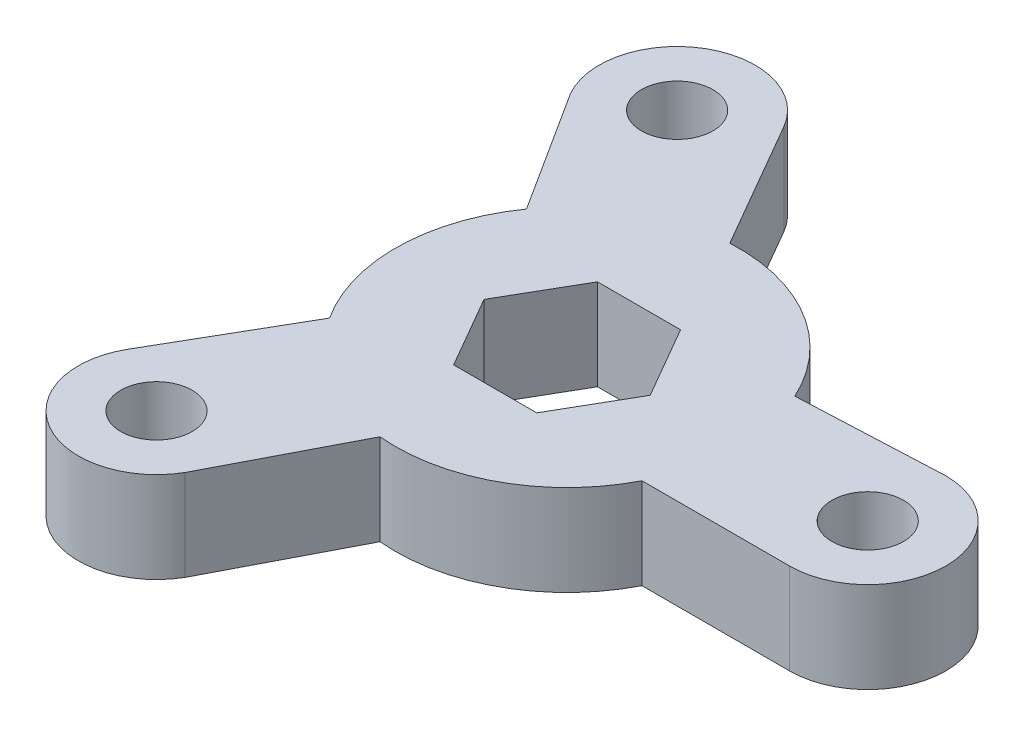
ISO-10303-21;
HEADER;
FILE_DESCRIPTION(('STEP AP214'),'2;1');
FILE_NAME('part.step','',(''),(''),'','','');
FILE_SCHEMA(('AUTOMOTIVE_DESIGN { 1 0 10303 214 1 1 1 1 }'));
ENDSEC;
DATA;
#1=APPLICATION_CONTEXT('core data for automotive mechanical design processes');
#2=APPLICATION_PROTOCOL_DEFINITION('international standard','automotive_design',2000,#1);
#3=PRODUCT_CONTEXT('',#1,'mechanical');
#4=PRODUCT('Part','Part','',(#3));
#5=PRODUCT_RELATED_PRODUCT_CATEGORY('part','',(#4));
#6=PRODUCT_DEFINITION_FORMATION('','',#4);
#7=PRODUCT_DEFINITION_CONTEXT('part definition',#1,'design');
#8=PRODUCT_DEFINITION('design','',#6,#7);
#9=PRODUCT_DEFINITION_SHAPE('','',#8);
#10=(LENGTH_UNIT() NAMED_UNIT(*) SI_UNIT(.MILLI.,.METRE.));
#11=(NAMED_UNIT(*) PLANE_ANGLE_UNIT() SI_UNIT($,.RADIAN.));
#12=(NAMED_UNIT(*) SI_UNIT($,.STERADIAN.) SOLID_ANGLE_UNIT());
#13=UNCERTAINTY_MEASURE_WITH_UNIT(LENGTH_MEASURE(1.E-05),#10,'distance_accuracy_value','');
#14=(GEOMETRIC_REPRESENTATION_CONTEXT(3) GLOBAL_UNCERTAINTY_ASSIGNED_CONTEXT((#13)) GLOBAL_UNIT_ASSIGNED_CONTEXT((#10,
#11,#12)) REPRESENTATION_CONTEXT('',''));
#15=CARTESIAN_POINT('',(0.,0.,0.));
#16=DIRECTION('',(0.,0.,1.));
#17=DIRECTION('',(1.,0.,0.));
#18=AXIS2_PLACEMENT_3D('',#15,#16,#17);
#19=CARTESIAN_POINT('',(4.16792281511756,3.175,-2.40635135926971));
#20=DIRECTION('',(-0.866025403784439,0.,0.5));
#21=DIRECTION('',(0.5,0.,0.866025403784439));
#22=AXIS2_PLACEMENT_3D('',#19,#20,#21);
#23=PLANE('',#22);
#24=DIRECTION('',(-0.5,0.,-0.866025403784439));
#25=VECTOR('',#24,1.);
#26=CARTESIAN_POINT('',(4.16792281511756,0.,-2.40635135926971));
#27=LINE('',#26,#25);
#28=CARTESIAN_POINT('',(5.41594714437485,0.,-0.244709811914002));
#29=VERTEX_POINT('',#28);
#30=CARTESIAN_POINT('',(3.96535459303568,0.,-2.75720981191441));
#31=VERTEX_POINT('',#30);
#32=EDGE_CURVE('E240',#29,#31,#27,.T.);
#33=ORIENTED_EDGE('',*,*,#32,.F.);
#34=DIRECTION('',(0.,-1.,0.));
#35=VECTOR('',#34,1.);
#36=CARTESIAN_POINT('',(5.41594714437485,3.175,-0.244709811914002));
#37=LINE('',#36,#35);
#38=CARTESIAN_POINT('',(5.41594714437485,3.175,-0.244709811914002));
#39=VERTEX_POINT('',#38);
#40=EDGE_CURVE('E11',#39,#29,#37,.T.);
#41=ORIENTED_EDGE('',*,*,#40,.F.);
#42=DIRECTION('',(-0.5,0.,-0.866025403784439));
#43=VECTOR('',#42,1.);
#44=CARTESIAN_POINT('',(4.16792281511756,3.175,-2.40635135926971));
#45=LINE('',#44,#43);
#46=CARTESIAN_POINT('',(3.96535459303568,3.175,-2.75720981191441));
#47=VERTEX_POINT('',#46);
#48=EDGE_CURVE('E341',#39,#47,#45,.T.);
#49=ORIENTED_EDGE('',*,*,#48,.T.);
#50=DIRECTION('',(0.,-1.,0.));
#51=VECTOR('',#50,1.);
#52=CARTESIAN_POINT('',(3.96535459303568,3.175,-2.75720981191441));
#53=LINE('',#52,#51);
#54=EDGE_CURVE('E56',#47,#31,#53,.T.);
#55=ORIENTED_EDGE('',*,*,#54,.T.);
#56=EDGE_LOOP('',(#33,#41,#49,#55));
#57=FACE_BOUND('',#56,.T.);
#58=ADVANCED_FACE('F37',(#57),#23,.T.);
#59=CARTESIAN_POINT('',(3.95599790144547,3.175,2.28399645331314));
#60=DIRECTION('',(-0.866025403784439,0.,-0.5));
#61=DIRECTION('',(-0.5,0.,0.866025403784439));
#62=AXIS2_PLACEMENT_3D('',#59,#60,#61);
#63=PLANE('',#62);
#64=DIRECTION('',(0.5,0.,-0.866025403784439));
#65=VECTOR('',#64,1.);
#66=CARTESIAN_POINT('',(3.95599790144547,0.,2.28399645331314));
#67=LINE('',#66,#65);
#68=CARTESIAN_POINT('',(3.96535459303568,0.,2.26779018808813));
#69=VERTEX_POINT('',#68);
#70=EDGE_CURVE('E242',#69,#29,#67,.T.);
#71=ORIENTED_EDGE('',*,*,#70,.F.);
#72=DIRECTION('',(0.,-1.,0.));
#73=VECTOR('',#72,1.);
#74=CARTESIAN_POINT('',(3.96535459303568,3.175,2.26779018808813));
#75=LINE('',#74,#73);
#76=CARTESIAN_POINT('',(3.96535459303568,3.175,2.26779018808813));
#77=VERTEX_POINT('',#76);
#78=EDGE_CURVE('E47',#77,#69,#75,.T.);
#79=ORIENTED_EDGE('',*,*,#78,.F.);
#80=DIRECTION('',(0.5,0.,-0.866025403784439));
#81=VECTOR('',#80,1.);
#82=CARTESIAN_POINT('',(3.95599790144547,3.175,2.28399645331314));
#83=LINE('',#82,#81);
#84=EDGE_CURVE('E343',#77,#39,#83,.T.);
#85=ORIENTED_EDGE('',*,*,#84,.T.);
#86=ORIENTED_EDGE('',*,*,#40,.T.);
#87=EDGE_LOOP('',(#71,#79,#85,#86));
#88=FACE_BOUND('',#87,.T.);
#89=ADVANCED_FACE('F367',(#88),#63,.T.);
#90=CARTESIAN_POINT('',(0.,3.175,2.26779018808813));
#91=DIRECTION('',(0.,0.,-1.));
#92=DIRECTION('',(-1.,0.,0.));
#93=AXIS2_PLACEMENT_3D('',#90,#91,#92);
#94=PLANE('',#93);
#95=DIRECTION('',(1.,0.,0.));
#96=VECTOR('',#95,1.);
#97=CARTESIAN_POINT('',(0.,0.,2.26779018808813));
#98=LINE('',#97,#96);
#99=CARTESIAN_POINT('',(1.06416949035638,0.,2.26779018808819));
#100=VERTEX_POINT('',#99);
#101=EDGE_CURVE('E245',#100,#69,#98,.T.);
#102=ORIENTED_EDGE('',*,*,#101,.F.);
#103=DIRECTION('',(0.,-1.,0.));
#104=VECTOR('',#103,1.);
#105=CARTESIAN_POINT('',(1.06416949035638,3.175,2.26779018808819));
#106=LINE('',#105,#104);
#107=CARTESIAN_POINT('',(1.06416949035638,3.175,2.26779018808819));
#108=VERTEX_POINT('',#107);
#109=EDGE_CURVE('E179',#108,#100,#106,.T.);
#110=ORIENTED_EDGE('',*,*,#109,.F.);
#111=DIRECTION('',(1.,0.,0.));
#112=VECTOR('',#111,1.);
#113=CARTESIAN_POINT('',(0.,3.175,2.26779018808813));
#114=LINE('',#113,#112);
#115=EDGE_CURVE('E191',#108,#77,#114,.T.);
#116=ORIENTED_EDGE('',*,*,#115,.T.);
#117=ORIENTED_EDGE('',*,*,#78,.T.);
#118=EDGE_LOOP('',(#102,#110,#116,#117));
#119=FACE_BOUND('',#118,.T.);
#120=ADVANCED_FACE('F347',(#119),#94,.T.);
#121=CARTESIAN_POINT('',(-0.183854838901459,3.175,0.106148640731575));
#122=DIRECTION('',(0.866025403784435,0.,-0.500000000000006));
#123=DIRECTION('',(-0.500000000000006,0.,-0.866025403784435));
#124=AXIS2_PLACEMENT_3D('',#121,#122,#123);
#125=PLANE('',#124);
#126=DIRECTION('',(0.500000000000006,0.,0.866025403784435));
#127=VECTOR('',#126,1.);
#128=CARTESIAN_POINT('',(-0.183854838901459,0.,0.106148640731575));
#129=LINE('',#128,#127);
#130=CARTESIAN_POINT('',(-0.386423060983354,0.,-0.244709811913157));
#131=VERTEX_POINT('',#130);
#132=EDGE_CURVE('E175',#131,#100,#129,.T.);
#133=ORIENTED_EDGE('',*,*,#132,.F.);
#134=DIRECTION('',(0.,-1.,0.));
#135=VECTOR('',#134,1.);
#136=CARTESIAN_POINT('',(-0.386423060983354,3.175,-0.244709811913157));
#137=LINE('',#136,#135);
#138=CARTESIAN_POINT('',(-0.386423060983354,3.175,-0.244709811913157));
#139=VERTEX_POINT('',#138);
#140=EDGE_CURVE('E170',#139,#131,#137,.T.);
#141=ORIENTED_EDGE('',*,*,#140,.F.);
#142=DIRECTION('',(0.500000000000006,0.,0.866025403784435));
#143=VECTOR('',#142,1.);
#144=CARTESIAN_POINT('',(-0.183854838901459,3.175,0.106148640731575));
#145=LINE('',#144,#143);
#146=EDGE_CURVE('E173',#139,#108,#145,.T.);
#147=ORIENTED_EDGE('',*,*,#146,.T.);
#148=ORIENTED_EDGE('',*,*,#109,.T.);
#149=EDGE_LOOP('',(#133,#141,#147,#148));
#150=FACE_BOUND('',#149,.T.);
#151=ADVANCED_FACE('F172',(#150),#125,.T.);
#152=CARTESIAN_POINT('',(-0.395779752573566,3.175,-0.228503546688159));
#153=DIRECTION('',(0.866025403784432,0.,0.500000000000012));
#154=DIRECTION('',(0.500000000000012,0.,-0.866025403784432));
#155=AXIS2_PLACEMENT_3D('',#152,#153,#154);
#156=PLANE('',#155);
#157=DIRECTION('',(-0.500000000000012,0.,0.866025403784432));
#158=VECTOR('',#157,1.);
#159=CARTESIAN_POINT('',(-0.395779752573566,0.,-0.228503546688159));
#160=LINE('',#159,#158);
#161=CARTESIAN_POINT('',(1.06416949035712,0.,-2.75720981191441));
#162=VERTEX_POINT('',#161);
#163=EDGE_CURVE('E249',#162,#131,#160,.T.);
#164=ORIENTED_EDGE('',*,*,#163,.F.);
#165=DIRECTION('',(0.,-1.,0.));
#166=VECTOR('',#165,1.);
#167=CARTESIAN_POINT('',(1.06416949035712,3.175,-2.75720981191441));
#168=LINE('',#167,#166);
#169=CARTESIAN_POINT('',(1.06416949035712,3.175,-2.75720981191441));
#170=VERTEX_POINT('',#169);
#171=EDGE_CURVE('E111',#170,#162,#168,.T.);
#172=ORIENTED_EDGE('',*,*,#171,.F.);
#173=DIRECTION('',(-0.500000000000012,0.,0.866025403784432));
#174=VECTOR('',#173,1.);
#175=CARTESIAN_POINT('',(-0.395779752573566,3.175,-0.228503546688159));
#176=LINE('',#175,#174);
#177=EDGE_CURVE('E188',#170,#139,#176,.T.);
#178=ORIENTED_EDGE('',*,*,#177,.T.);
#179=ORIENTED_EDGE('',*,*,#140,.T.);
#180=EDGE_LOOP('',(#164,#172,#178,#179));
#181=FACE_BOUND('',#180,.T.);
#182=ADVANCED_FACE('F193',(#181),#156,.T.);
#183=CARTESIAN_POINT('',(3.87987291900672,3.175,2.01140464348408));
#184=DIRECTION('',(-0.887790184262467,0.,-0.460248398940414));
#185=DIRECTION('',(-0.460248398940414,0.,0.887790184262467));
#186=AXIS2_PLACEMENT_3D('',#183,#184,#185);
#187=PLANE('',#186);
#188=DIRECTION('',(0.460248398940414,0.,-0.887790184262467));
#189=VECTOR('',#188,1.);
#190=CARTESIAN_POINT('',(3.87987291900672,0.,2.01140464348408));
#191=LINE('',#190,#189);
#192=CARTESIAN_POINT('',(-0.371989304252298,0.,10.2129791744026));
#193=VERTEX_POINT('',#192);
#194=CARTESIAN_POINT('',(1.95264752249864,0.,5.72890109500861));
#195=VERTEX_POINT('',#194);
#196=EDGE_CURVE('E209',#193,#195,#191,.T.);
#197=ORIENTED_EDGE('',*,*,#196,.T.);
#198=DIRECTION('',(0.,-1.,0.));
#199=VECTOR('',#198,1.);
#200=CARTESIAN_POINT('',(1.95264752249864,3.175,5.72890109500861));
#201=LINE('',#200,#199);
#202=CARTESIAN_POINT('',(1.95264752249864,3.175,5.72890109500861));
#203=VERTEX_POINT('',#202);
#204=EDGE_CURVE('E41',#203,#195,#201,.T.);
#205=ORIENTED_EDGE('',*,*,#204,.F.);
#206=DIRECTION('',(0.460248398940414,0.,-0.887790184262467));
#207=VECTOR('',#206,1.);
#208=CARTESIAN_POINT('',(3.87987291900672,3.175,2.01140464348408));
#209=LINE('',#208,#207);
#210=CARTESIAN_POINT('',(-0.371989304252298,3.175,10.2129791744026));
#211=VERTEX_POINT('',#210);
#212=EDGE_CURVE('E263',#211,#203,#209,.T.);
#213=ORIENTED_EDGE('',*,*,#212,.F.);
#214=DIRECTION('',(0.,-1.,0.));
#215=VECTOR('',#214,1.);
#216=CARTESIAN_POINT('',(-0.371989304252298,3.175,10.2129791744026));
#217=LINE('',#216,#215);
#218=EDGE_CURVE('E208',#211,#193,#217,.T.);
#219=ORIENTED_EDGE('',*,*,#218,.T.);
#220=EDGE_LOOP('',(#197,#205,#213,#219));
#221=FACE_BOUND('',#220,.T.);
#222=ADVANCED_FACE('F39',(#221),#187,.F.);
#223=CARTESIAN_POINT('',(2.51476204169658,3.175,-0.244709811914002));
#224=DIRECTION('',(0.,-1.,0.));
#225=DIRECTION('',(0.,0.,-1.));
#226=AXIS2_PLACEMENT_3D('',#223,#224,#225);
#227=CYLINDRICAL_SURFACE('',#226,5.99999999999883);
#228=CARTESIAN_POINT('',(2.51476204169658,0.,-0.244709811914002));
#229=DIRECTION('',(0.,1.,0.));
#230=DIRECTION('',(0.,0.,1.));
#231=AXIS2_PLACEMENT_3D('',#228,#229,#230);
#232=CIRCLE('',#231,5.99999999999883);
#233=CARTESIAN_POINT('',(7.85830091889646,0.,2.48413468124454));
#234=VERTEX_POINT('',#233);
#235=EDGE_CURVE('E212',#195,#234,#232,.T.);
#236=ORIENTED_EDGE('',*,*,#235,.T.);
#237=DIRECTION('',(0.,-1.,0.));
#238=VECTOR('',#237,1.);
#239=CARTESIAN_POINT('',(7.85830091889646,3.175,2.48413468124454));
#240=LINE('',#239,#238);
#241=CARTESIAN_POINT('',(7.85830091889646,3.175,2.48413468124454));
#242=VERTEX_POINT('',#241);
#243=EDGE_CURVE('E291',#242,#234,#240,.T.);
#244=ORIENTED_EDGE('',*,*,#243,.F.);
#245=CARTESIAN_POINT('',(2.51476204169658,3.175,-0.244709811914002));
#246=DIRECTION('',(0.,1.,0.));
#247=DIRECTION('',(0.,0.,1.));
#248=AXIS2_PLACEMENT_3D('',#245,#246,#247);
#249=CIRCLE('',#248,5.99999999999883);
#250=EDGE_CURVE('E124',#203,#242,#249,.T.);
#251=ORIENTED_EDGE('',*,*,#250,.F.);
#252=ORIENTED_EDGE('',*,*,#204,.T.);
#253=EDGE_LOOP('',(#236,#244,#251,#252));
#254=FACE_BOUND('',#253,.T.);
#255=ADVANCED_FACE('F296',(#254),#227,.T.);
#256=CARTESIAN_POINT('',(0.,3.175,2.48413468124462));
#257=DIRECTION('',(0.,0.,1.));
#258=DIRECTION('',(1.,0.,0.));
#259=AXIS2_PLACEMENT_3D('',#256,#257,#258);
#260=PLANE('',#259);
#261=DIRECTION('',(-1.,0.,0.));
#262=VECTOR('',#261,1.);
#263=CARTESIAN_POINT('',(0.,0.,2.48413468124462));
#264=LINE('',#263,#262);
#265=CARTESIAN_POINT('',(13.0147620416956,0.,2.48413468124462));
#266=VERTEX_POINT('',#265);
#267=EDGE_CURVE('E215',#266,#234,#264,.T.);
#268=ORIENTED_EDGE('',*,*,#267,.F.);
#269=DIRECTION('',(0.,-1.,0.));
#270=VECTOR('',#269,1.);
#271=CARTESIAN_POINT('',(13.0147620416956,3.175,2.48413468124462));
#272=LINE('',#271,#270);
#273=CARTESIAN_POINT('',(13.0147620416956,3.175,2.48413468124462));
#274=VERTEX_POINT('',#273);
#275=EDGE_CURVE('E290',#274,#266,#272,.T.);
#276=ORIENTED_EDGE('',*,*,#275,.F.);
#277=DIRECTION('',(-1.,0.,0.));
#278=VECTOR('',#277,1.);
#279=CARTESIAN_POINT('',(0.,3.175,2.48413468124462));
#280=LINE('',#279,#278);
#281=EDGE_CURVE('E311',#274,#242,#280,.T.);
#282=ORIENTED_EDGE('',*,*,#281,.T.);
#283=ORIENTED_EDGE('',*,*,#243,.T.);
#284=EDGE_LOOP('',(#268,#276,#282,#283));
#285=FACE_BOUND('',#284,.T.);
#286=ADVANCED_FACE('F308',(#285),#260,.T.);
#287=CARTESIAN_POINT('',(13.0147620416956,3.175,-0.244709811913141));
#288=DIRECTION('',(0.,-1.,0.));
#289=DIRECTION('',(0.,0.,-1.));
#290=AXIS2_PLACEMENT_3D('',#287,#288,#289);
#291=CYLINDRICAL_SURFACE('',#290,2.72884449315776);
#292=CARTESIAN_POINT('',(13.0147620416956,0.,-0.244709811913141));
#293=DIRECTION('',(0.,1.,0.));
#294=DIRECTION('',(0.,0.,1.));
#295=AXIS2_PLACEMENT_3D('',#292,#293,#294);
#296=CIRCLE('',#295,2.72884449315776);
#297=CARTESIAN_POINT('',(13.0147620416966,0.,-2.97355430507091));
#298=VERTEX_POINT('',#297);
#299=EDGE_CURVE('E218',#266,#298,#296,.T.);
#300=ORIENTED_EDGE('',*,*,#299,.T.);
#301=DIRECTION('',(0.,-1.,0.));
#302=VECTOR('',#301,1.);
#303=CARTESIAN_POINT('',(13.0147620416966,3.175,-2.97355430507091));
#304=LINE('',#303,#302);
#305=CARTESIAN_POINT('',(13.0147620416966,3.175,-2.97355430507091));
#306=VERTEX_POINT('',#305);
#307=EDGE_CURVE('E287',#306,#298,#304,.T.);
#308=ORIENTED_EDGE('',*,*,#307,.F.);
#309=CARTESIAN_POINT('',(13.0147620416956,3.175,-0.244709811913141));
#310=DIRECTION('',(0.,1.,0.));
#311=DIRECTION('',(0.,0.,1.));
#312=AXIS2_PLACEMENT_3D('',#309,#310,#311);
#313=CIRCLE('',#312,2.72884449315776);
#314=EDGE_CURVE('E314',#274,#306,#313,.T.);
#315=ORIENTED_EDGE('',*,*,#314,.F.);
#316=ORIENTED_EDGE('',*,*,#275,.T.);
#317=EDGE_LOOP('',(#300,#308,#315,#316));
#318=FACE_BOUND('',#317,.T.);
#319=ADVANCED_FACE('F315',(#318),#291,.T.);
#320=CARTESIAN_POINT('',(-0.107871058470792,3.175,-2.37837906979592));
#321=DIRECTION('',(0.045308286597738,0.,0.998973052271971));
#322=DIRECTION('',(0.998973052271971,0.,-0.045308286597738));
#323=AXIS2_PLACEMENT_3D('',#320,#321,#322);
#324=PLANE('',#323);
#325=DIRECTION('',(-0.998973052271971,0.,0.045308286597738));
#326=VECTOR('',#325,1.);
#327=CARTESIAN_POINT('',(-0.107871058470792,0.,-2.37837906979592));
#328=LINE('',#327,#326);
#329=CARTESIAN_POINT('',(7.96911809901369,0.,-2.7447098119133));
#330=VERTEX_POINT('',#329);
#331=EDGE_CURVE('E220',#298,#330,#328,.T.);
#332=ORIENTED_EDGE('',*,*,#331,.T.);
#333=DIRECTION('',(0.,-1.,0.));
#334=VECTOR('',#333,1.);
#335=CARTESIAN_POINT('',(7.96911809901369,3.175,-2.7447098119133));
#336=LINE('',#335,#334);
#337=CARTESIAN_POINT('',(7.96911809901369,3.175,-2.7447098119133));
#338=VERTEX_POINT('',#337);
#339=EDGE_CURVE('E284',#338,#330,#336,.T.);
#340=ORIENTED_EDGE('',*,*,#339,.F.);
#341=DIRECTION('',(-0.998973052271971,0.,0.045308286597738));
#342=VECTOR('',#341,1.);
#343=CARTESIAN_POINT('',(-0.107871058470792,3.175,-2.37837906979592));
#344=LINE('',#343,#342);
#345=EDGE_CURVE('E318',#306,#338,#344,.T.);
#346=ORIENTED_EDGE('',*,*,#345,.F.);
#347=ORIENTED_EDGE('',*,*,#307,.T.);
#348=EDGE_LOOP('',(#332,#340,#346,#347));
#349=FACE_BOUND('',#348,.T.);
#350=ADVANCED_FACE('F399',(#349),#324,.F.);
#351=CARTESIAN_POINT('',(2.51476204169658,3.175,-0.244709811914002));
#352=DIRECTION('',(0.,-1.,0.));
#353=DIRECTION('',(0.,0.,-1.));
#354=AXIS2_PLACEMENT_3D('',#351,#352,#353);
#355=CYLINDRICAL_SURFACE('',#354,5.99999999999883);
#356=CARTESIAN_POINT('',(2.51476204169658,0.,-0.244709811914002));
#357=DIRECTION('',(0.,1.,0.));
#358=DIRECTION('',(0.,0.,1.));
#359=AXIS2_PLACEMENT_3D('',#356,#357,#358);
#360=CIRCLE('',#359,5.99999999999883);
#361=CARTESIAN_POINT('',(2.20624125714759,0.,-6.2367724722577));
#362=VERTEX_POINT('',#361);
#363=EDGE_CURVE('E222',#330,#362,#360,.T.);
#364=ORIENTED_EDGE('',*,*,#363,.T.);
#365=DIRECTION('',(0.,-1.,0.));
#366=VECTOR('',#365,1.);
#367=CARTESIAN_POINT('',(2.20624125714759,3.175,-6.2367724722577));
#368=LINE('',#367,#366);
#369=CARTESIAN_POINT('',(2.20624125714759,3.175,-6.2367724722577));
#370=VERTEX_POINT('',#369);
#371=EDGE_CURVE('E282',#370,#362,#368,.T.);
#372=ORIENTED_EDGE('',*,*,#371,.F.);
#373=CARTESIAN_POINT('',(2.51476204169658,3.175,-0.244709811914002));
#374=DIRECTION('',(0.,1.,0.));
#375=DIRECTION('',(0.,0.,1.));
#376=AXIS2_PLACEMENT_3D('',#373,#374,#375);
#377=CIRCLE('',#376,5.99999999999883);
#378=EDGE_CURVE('E325',#338,#370,#377,.T.);
#379=ORIENTED_EDGE('',*,*,#378,.F.);
#380=ORIENTED_EDGE('',*,*,#339,.T.);
#381=EDGE_LOOP('',(#364,#372,#379,#380));
#382=FACE_BOUND('',#381,.T.);
#383=ADVANCED_FACE('F395',(#382),#355,.T.);
#384=CARTESIAN_POINT('',(4.35528264215995,3.175,-2.51452360584794));
#385=DIRECTION('',(0.866025403784439,0.,-0.499999999999999));
#386=DIRECTION('',(-0.499999999999999,0.,-0.866025403784439));
#387=AXIS2_PLACEMENT_3D('',#384,#385,#386);
#388=PLANE('',#387);
#389=DIRECTION('',(0.499999999999999,0.,0.866025403784439));
#390=VECTOR('',#389,1.);
#391=CARTESIAN_POINT('',(4.35528264215995,0.,-2.51452360584794));
#392=LINE('',#391,#390);
#393=CARTESIAN_POINT('',(-0.371989304251888,0.,-10.7023987982283));
#394=VERTEX_POINT('',#393);
#395=EDGE_CURVE('E225',#394,#362,#392,.T.);
#396=ORIENTED_EDGE('',*,*,#395,.F.);
#397=DIRECTION('',(0.,-1.,0.));
#398=VECTOR('',#397,1.);
#399=CARTESIAN_POINT('',(-0.371989304251888,3.175,-10.7023987982283));
#400=LINE('',#399,#398);
#401=CARTESIAN_POINT('',(-0.371989304251888,3.175,-10.7023987982283));
#402=VERTEX_POINT('',#401);
#403=EDGE_CURVE('E280',#402,#394,#400,.T.);
#404=ORIENTED_EDGE('',*,*,#403,.F.);
#405=DIRECTION('',(0.499999999999999,0.,0.866025403784439));
#406=VECTOR('',#405,1.);
#407=CARTESIAN_POINT('',(4.35528264215995,3.175,-2.51452360584794));
#408=LINE('',#407,#406);
#409=EDGE_CURVE('E327',#402,#370,#408,.T.);
#410=ORIENTED_EDGE('',*,*,#409,.T.);
#411=ORIENTED_EDGE('',*,*,#371,.T.);
#412=EDGE_LOOP('',(#396,#404,#410,#411));
#413=FACE_BOUND('',#412,.T.);
#414=ADVANCED_FACE('F391',(#413),#388,.T.);
#415=CARTESIAN_POINT('',(-2.73523795830378,3.175,-9.3379765516494));
#416=DIRECTION('',(0.,-1.,0.));
#417=DIRECTION('',(0.,0.,-1.));
#418=AXIS2_PLACEMENT_3D('',#415,#416,#417);
#419=CYLINDRICAL_SURFACE('',#418,2.72884449315776);
#420=CARTESIAN_POINT('',(-2.73523795830378,0.,-9.3379765516494));
#421=DIRECTION('',(0.,1.,0.));
#422=DIRECTION('',(0.,0.,1.));
#423=AXIS2_PLACEMENT_3D('',#420,#421,#422);
#424=CIRCLE('',#423,2.72884449315776);
#425=CARTESIAN_POINT('',(-5.09848661235614,0.,-7.97355430507133));
#426=VERTEX_POINT('',#425);
#427=EDGE_CURVE('E228',#394,#426,#424,.T.);
#428=ORIENTED_EDGE('',*,*,#427,.T.);
#429=DIRECTION('',(0.,-1.,0.));
#430=VECTOR('',#429,1.);
#431=CARTESIAN_POINT('',(-5.09848661235614,3.175,-7.97355430507133));
#432=LINE('',#431,#430);
#433=CARTESIAN_POINT('',(-5.09848661235614,3.175,-7.97355430507133));
#434=VERTEX_POINT('',#433);
#435=EDGE_CURVE('E277',#434,#426,#432,.T.);
#436=ORIENTED_EDGE('',*,*,#435,.F.);
#437=CARTESIAN_POINT('',(-2.73523795830378,3.175,-9.3379765516494));
#438=DIRECTION('',(0.,1.,0.));
#439=DIRECTION('',(0.,0.,1.));
#440=AXIS2_PLACEMENT_3D('',#437,#438,#439);
#441=CIRCLE('',#440,2.72884449315776);
#442=EDGE_CURVE('E330',#402,#434,#441,.T.);
#443=ORIENTED_EDGE('',*,*,#442,.F.);
#444=ORIENTED_EDGE('',*,*,#403,.T.);
#445=EDGE_LOOP('',(#428,#436,#443,#444));
#446=FACE_BOUND('',#445,.T.);
#447=ADVANCED_FACE('F387',(#446),#419,.T.);
#448=CARTESIAN_POINT('',(0.000141202008173699,3.175,-9.02915577342994E-05));
#449=DIRECTION('',(0.842481897664738,0.,-0.538724653331571));
#450=DIRECTION('',(-0.538724653331571,0.,-0.842481897664738));
#451=AXIS2_PLACEMENT_3D('',#448,#449,#450);
#452=PLANE('',#451);
#453=DIRECTION('',(0.538724653331571,0.,0.842481897664738));
#454=VECTOR('',#453,1.);
#455=CARTESIAN_POINT('',(0.000141202008173699,0.,-9.02915577342994E-05));
#456=LINE('',#455,#454);
#457=CARTESIAN_POINT('',(-2.37747949642372,0.,-3.71832071883545));
#458=VERTEX_POINT('',#457);
#459=EDGE_CURVE('E230',#426,#458,#456,.T.);
#460=ORIENTED_EDGE('',*,*,#459,.T.);
#461=DIRECTION('',(0.,-1.,0.));
#462=VECTOR('',#461,1.);
#463=CARTESIAN_POINT('',(-2.37747949642372,3.175,-3.71832071883545));
#464=LINE('',#463,#462);
#465=CARTESIAN_POINT('',(-2.37747949642372,3.175,-3.71832071883545));
#466=VERTEX_POINT('',#465);
#467=EDGE_CURVE('E274',#466,#458,#464,.T.);
#468=ORIENTED_EDGE('',*,*,#467,.F.);
#469=DIRECTION('',(0.538724653331571,0.,0.842481897664738));
#470=VECTOR('',#469,1.);
#471=CARTESIAN_POINT('',(0.000141202008173699,3.175,-9.02915577342994E-05));
#472=LINE('',#471,#470);
#473=EDGE_CURVE('E332',#434,#466,#472,.T.);
#474=ORIENTED_EDGE('',*,*,#473,.F.);
#475=ORIENTED_EDGE('',*,*,#435,.T.);
#476=EDGE_LOOP('',(#460,#468,#474,#475));
#477=FACE_BOUND('',#476,.T.);
#478=ADVANCED_FACE('F383',(#477),#452,.F.);
#479=CARTESIAN_POINT('',(2.51476204169658,3.175,-0.244709811914002));
#480=DIRECTION('',(0.,-1.,0.));
#481=DIRECTION('',(0.,0.,-1.));
#482=AXIS2_PLACEMENT_3D('',#479,#480,#481);
#483=CYLINDRICAL_SURFACE('',#482,5.99999999999883);
#484=CARTESIAN_POINT('',(2.51476204169658,0.,-0.244709811914002));
#485=DIRECTION('',(0.,1.,0.));
#486=DIRECTION('',(0.,0.,1.));
#487=AXIS2_PLACEMENT_3D('',#484,#485,#486);
#488=CIRCLE('',#487,5.99999999999883);
#489=CARTESIAN_POINT('',(-2.5202560509557,0.,3.01850835527313));
#490=VERTEX_POINT('',#489);
#491=EDGE_CURVE('E232',#458,#490,#488,.T.);
#492=ORIENTED_EDGE('',*,*,#491,.T.);
#493=DIRECTION('',(0.,-1.,0.));
#494=VECTOR('',#493,1.);
#495=CARTESIAN_POINT('',(-2.5202560509557,3.175,3.01850835527313));
#496=LINE('',#495,#494);
#497=CARTESIAN_POINT('',(-2.5202560509557,3.175,3.01850835527313));
#498=VERTEX_POINT('',#497);
#499=EDGE_CURVE('E272',#498,#490,#496,.T.);
#500=ORIENTED_EDGE('',*,*,#499,.F.);
#501=CARTESIAN_POINT('',(2.51476204169658,3.175,-0.244709811914002));
#502=DIRECTION('',(0.,1.,0.));
#503=DIRECTION('',(0.,0.,1.));
#504=AXIS2_PLACEMENT_3D('',#501,#502,#503);
#505=CIRCLE('',#504,5.99999999999883);
#506=EDGE_CURVE('E334',#466,#498,#505,.T.);
#507=ORIENTED_EDGE('',*,*,#506,.F.);
#508=ORIENTED_EDGE('',*,*,#467,.T.);
#509=EDGE_LOOP('',(#492,#500,#507,#508));
#510=FACE_BOUND('',#509,.T.);
#511=ADVANCED_FACE('F379',(#510),#483,.T.);
#512=CARTESIAN_POINT('',(-0.583139579616138,3.175,-0.336675793266482));
#513=DIRECTION('',(-0.866025403784452,0.,-0.499999999999977));
#514=DIRECTION('',(-0.499999999999977,0.,0.866025403784452));
#515=AXIS2_PLACEMENT_3D('',#512,#513,#514);
#516=PLANE('',#515);
#517=DIRECTION('',(0.499999999999977,0.,-0.866025403784452));
#518=VECTOR('',#517,1.);
#519=CARTESIAN_POINT('',(-0.583139579616138,0.,-0.336675793266482));
#520=LINE('',#519,#518);
#521=CARTESIAN_POINT('',(-5.09848661235567,0.,7.48413468124424));
#522=VERTEX_POINT('',#521);
#523=EDGE_CURVE('E235',#522,#490,#520,.T.);
#524=ORIENTED_EDGE('',*,*,#523,.F.);
#525=DIRECTION('',(0.,-1.,0.));
#526=VECTOR('',#525,1.);
#527=CARTESIAN_POINT('',(-5.09848661235567,3.175,7.48413468124424));
#528=LINE('',#527,#526);
#529=CARTESIAN_POINT('',(-5.09848661235567,3.175,7.48413468124424));
#530=VERTEX_POINT('',#529);
#531=EDGE_CURVE('E270',#530,#522,#528,.T.);
#532=ORIENTED_EDGE('',*,*,#531,.F.);
#533=DIRECTION('',(0.499999999999977,0.,-0.866025403784452));
#534=VECTOR('',#533,1.);
#535=CARTESIAN_POINT('',(-0.583139579616138,3.175,-0.336675793266482));
#536=LINE('',#535,#534);
#537=EDGE_CURVE('E336',#530,#498,#536,.T.);
#538=ORIENTED_EDGE('',*,*,#537,.T.);
#539=ORIENTED_EDGE('',*,*,#499,.T.);
#540=EDGE_LOOP('',(#524,#532,#538,#539));
#541=FACE_BOUND('',#540,.T.);
#542=ADVANCED_FACE('F376',(#541),#516,.T.);
#543=CARTESIAN_POINT('',(13.0147620416966,3.175,-0.244709811914002));
#544=DIRECTION('',(0.,-1.,0.));
#545=DIRECTION('',(0.,0.,-1.));
#546=AXIS2_PLACEMENT_3D('',#543,#544,#545);
#547=CYLINDRICAL_SURFACE('',#546,1.24999999999883);
#548=CARTESIAN_POINT('',(13.0147620416966,3.175,-0.244709811914002));
#549=DIRECTION('',(0.,1.,0.));
#550=DIRECTION('',(0.,0.,1.));
#551=AXIS2_PLACEMENT_3D('',#548,#549,#550);
#552=CIRCLE('',#551,1.24999999999883);
#553=CARTESIAN_POINT('',(13.0147620416966,3.175,1.00529018808482));
#554=VERTEX_POINT('',#553);
#555=EDGE_CURVE('E202',#554,#554,#552,.T.);
#556=ORIENTED_EDGE('',*,*,#555,.T.);
#557=EDGE_LOOP('',(#556));
#558=FACE_BOUND('',#557,.T.);
#559=CARTESIAN_POINT('',(13.0147620416966,0.,-0.244709811914002));
#560=DIRECTION('',(0.,1.,0.));
#561=DIRECTION('',(0.,0.,1.));
#562=AXIS2_PLACEMENT_3D('',#559,#560,#561);
#563=CIRCLE('',#562,1.24999999999883);
#564=CARTESIAN_POINT('',(13.0147620416966,0.,1.00529018808482));
#565=VERTEX_POINT('',#564);
#566=EDGE_CURVE('E257',#565,#565,#563,.T.);
#567=ORIENTED_EDGE('',*,*,#566,.F.);
#568=EDGE_LOOP('',(#567));
#569=FACE_BOUND('',#568,.T.);
#570=ADVANCED_FACE('F362',(#558,#569),#547,.F.);
#571=CARTESIAN_POINT('',(-2.73523795830378,3.175,-9.3379765516494));
#572=DIRECTION('',(0.,-1.,0.));
#573=DIRECTION('',(0.,0.,-1.));
#574=AXIS2_PLACEMENT_3D('',#571,#572,#573);
#575=CYLINDRICAL_SURFACE('',#574,1.24999999999961);
#576=CARTESIAN_POINT('',(-2.73523795830378,3.175,-9.3379765516494));
#577=DIRECTION('',(0.,1.,0.));
#578=DIRECTION('',(0.,0.,1.));
#579=AXIS2_PLACEMENT_3D('',#576,#577,#578);
#580=CIRCLE('',#579,1.24999999999961);
#581=CARTESIAN_POINT('',(-2.73523795830378,3.175,-8.08797655164979));
#582=VERTEX_POINT('',#581);
#583=EDGE_CURVE('E196',#582,#582,#580,.T.);
#584=ORIENTED_EDGE('',*,*,#583,.T.);
#585=EDGE_LOOP('',(#584));
#586=FACE_BOUND('',#585,.T.);
#587=CARTESIAN_POINT('',(-2.73523795830378,0.,-9.3379765516494));
#588=DIRECTION('',(0.,1.,0.));
#589=DIRECTION('',(0.,0.,1.));
#590=AXIS2_PLACEMENT_3D('',#587,#588,#589);
#591=CIRCLE('',#590,1.24999999999961);
#592=CARTESIAN_POINT('',(-2.73523795830378,0.,-8.08797655164979));
#593=VERTEX_POINT('',#592);
#594=EDGE_CURVE('E254',#593,#593,#591,.T.);
#595=ORIENTED_EDGE('',*,*,#594,.F.);
#596=EDGE_LOOP('',(#595));
#597=FACE_BOUND('',#596,.T.);
#598=ADVANCED_FACE('F353',(#586,#597),#575,.F.);
#599=CARTESIAN_POINT('',(0.,3.175,-2.75720981191441));
#600=DIRECTION('',(0.,0.,1.));
#601=DIRECTION('',(1.,0.,0.));
#602=AXIS2_PLACEMENT_3D('',#599,#600,#601);
#603=PLANE('',#602);
#604=DIRECTION('',(-1.,0.,0.));
#605=VECTOR('',#604,1.);
#606=CARTESIAN_POINT('',(0.,0.,-2.75720981191441));
#607=LINE('',#606,#605);
#608=EDGE_CURVE('E251',#31,#162,#607,.T.);
#609=ORIENTED_EDGE('',*,*,#608,.F.);
#610=ORIENTED_EDGE('',*,*,#54,.F.);
#611=DIRECTION('',(-1.,0.,0.));
#612=VECTOR('',#611,1.);
#613=CARTESIAN_POINT('',(0.,3.175,-2.75720981191441));
#614=LINE('',#613,#612);
#615=EDGE_CURVE('E194',#47,#170,#614,.T.);
#616=ORIENTED_EDGE('',*,*,#615,.T.);
#617=ORIENTED_EDGE('',*,*,#171,.T.);
#618=EDGE_LOOP('',(#609,#610,#616,#617));
#619=FACE_BOUND('',#618,.T.);
#620=ADVANCED_FACE('F350',(#619),#603,.T.);
#621=CARTESIAN_POINT('',(-2.73523795830378,3.175,8.84855692782312));
#622=DIRECTION('',(0.,-1.,0.));
#623=DIRECTION('',(0.,0.,-1.));
#624=AXIS2_PLACEMENT_3D('',#621,#622,#623);
#625=CYLINDRICAL_SURFACE('',#624,2.72884449315774);
#626=CARTESIAN_POINT('',(-2.73523795830378,0.,8.84855692782312));
#627=DIRECTION('',(0.,1.,0.));
#628=DIRECTION('',(0.,0.,1.));
#629=AXIS2_PLACEMENT_3D('',#626,#627,#628);
#630=CIRCLE('',#629,2.72884449315774);
#631=EDGE_CURVE('E238',#522,#193,#630,.T.);
#632=ORIENTED_EDGE('',*,*,#631,.T.);
#633=ORIENTED_EDGE('',*,*,#218,.F.);
#634=CARTESIAN_POINT('',(-2.73523795830378,3.175,8.84855692782312));
#635=DIRECTION('',(0.,1.,0.));
#636=DIRECTION('',(0.,0.,1.));
#637=AXIS2_PLACEMENT_3D('',#634,#635,#636);
#638=CIRCLE('',#637,2.72884449315774);
#639=EDGE_CURVE('E339',#530,#211,#638,.T.);
#640=ORIENTED_EDGE('',*,*,#639,.F.);
#641=ORIENTED_EDGE('',*,*,#531,.T.);
#642=EDGE_LOOP('',(#632,#633,#640,#641));
#643=FACE_BOUND('',#642,.T.);
#644=ADVANCED_FACE('F352',(#643),#625,.T.);
#645=CARTESIAN_POINT('',(-2.73523795830342,3.175,8.8485569278226));
#646=DIRECTION('',(0.,-1.,0.));
#647=DIRECTION('',(0.,0.,-1.));
#648=AXIS2_PLACEMENT_3D('',#645,#646,#647);
#649=CYLINDRICAL_SURFACE('',#648,1.24999999999879);
#650=CARTESIAN_POINT('',(-2.73523795830342,3.175,8.8485569278226));
#651=DIRECTION('',(0.,1.,0.));
#652=DIRECTION('',(0.,0.,1.));
#653=AXIS2_PLACEMENT_3D('',#650,#651,#652);
#654=CIRCLE('',#653,1.24999999999879);
#655=CARTESIAN_POINT('',(-2.73523795830342,3.175,10.0985569278214));
#656=VERTEX_POINT('',#655);
#657=EDGE_CURVE('E205',#656,#656,#654,.T.);
#658=ORIENTED_EDGE('',*,*,#657,.T.);
#659=EDGE_LOOP('',(#658));
#660=FACE_BOUND('',#659,.T.);
#661=CARTESIAN_POINT('',(-2.73523795830342,0.,8.8485569278226));
#662=DIRECTION('',(0.,1.,0.));
#663=DIRECTION('',(0.,0.,1.));
#664=AXIS2_PLACEMENT_3D('',#661,#662,#663);
#665=CIRCLE('',#664,1.24999999999879);
#666=CARTESIAN_POINT('',(-2.73523795830342,0.,10.0985569278214));
#667=VERTEX_POINT('',#666);
#668=EDGE_CURVE('E260',#667,#667,#665,.T.);
#669=ORIENTED_EDGE('',*,*,#668,.F.);
#670=EDGE_LOOP('',(#669));
#671=FACE_BOUND('',#670,.T.);
#672=ADVANCED_FACE('F359',(#660,#671),#649,.F.);
#673=CARTESIAN_POINT('',(0.,3.175,0.));
#674=DIRECTION('',(0.,1.,0.));
#675=DIRECTION('',(0.,0.,1.));
#676=AXIS2_PLACEMENT_3D('',#673,#674,#675);
#677=PLANE('',#676);
#678=ORIENTED_EDGE('',*,*,#212,.T.);
#679=ORIENTED_EDGE('',*,*,#250,.T.);
#680=ORIENTED_EDGE('',*,*,#281,.F.);
#681=ORIENTED_EDGE('',*,*,#314,.T.);
#682=ORIENTED_EDGE('',*,*,#345,.T.);
#683=ORIENTED_EDGE('',*,*,#378,.T.);
#684=ORIENTED_EDGE('',*,*,#409,.F.);
#685=ORIENTED_EDGE('',*,*,#442,.T.);
#686=ORIENTED_EDGE('',*,*,#473,.T.);
#687=ORIENTED_EDGE('',*,*,#506,.T.);
#688=ORIENTED_EDGE('',*,*,#537,.F.);
#689=ORIENTED_EDGE('',*,*,#639,.T.);
#690=EDGE_LOOP('',(#678,#679,#680,#681,#682,#683,#684,#685,#686,#687,#688,#689));
#691=FACE_BOUND('',#690,.T.);
#692=ORIENTED_EDGE('',*,*,#48,.F.);
#693=ORIENTED_EDGE('',*,*,#84,.F.);
#694=ORIENTED_EDGE('',*,*,#115,.F.);
#695=ORIENTED_EDGE('',*,*,#146,.F.);
#696=ORIENTED_EDGE('',*,*,#177,.F.);
#697=ORIENTED_EDGE('',*,*,#615,.F.);
#698=EDGE_LOOP('',(#692,#693,#694,#695,#696,#697));
#699=FACE_BOUND('',#698,.T.);
#700=ORIENTED_EDGE('',*,*,#583,.F.);
#701=EDGE_LOOP('',(#700));
#702=FACE_BOUND('',#701,.T.);
#703=ORIENTED_EDGE('',*,*,#555,.F.);
#704=EDGE_LOOP('',(#703));
#705=FACE_BOUND('',#704,.T.);
#706=ORIENTED_EDGE('',*,*,#657,.F.);
#707=EDGE_LOOP('',(#706));
#708=FACE_BOUND('',#707,.T.);
#709=ADVANCED_FACE('F185',(#691,#699,#702,#705,#708),#677,.T.);
#710=CARTESIAN_POINT('',(0.,0.,0.));
#711=DIRECTION('',(0.,1.,0.));
#712=DIRECTION('',(0.,0.,1.));
#713=AXIS2_PLACEMENT_3D('',#710,#711,#712);
#714=PLANE('',#713);
#715=ORIENTED_EDGE('',*,*,#196,.F.);
#716=ORIENTED_EDGE('',*,*,#631,.F.);
#717=ORIENTED_EDGE('',*,*,#523,.T.);
#718=ORIENTED_EDGE('',*,*,#491,.F.);
#719=ORIENTED_EDGE('',*,*,#459,.F.);
#720=ORIENTED_EDGE('',*,*,#427,.F.);
#721=ORIENTED_EDGE('',*,*,#395,.T.);
#722=ORIENTED_EDGE('',*,*,#363,.F.);
#723=ORIENTED_EDGE('',*,*,#331,.F.);
#724=ORIENTED_EDGE('',*,*,#299,.F.);
#725=ORIENTED_EDGE('',*,*,#267,.T.);
#726=ORIENTED_EDGE('',*,*,#235,.F.);
#727=EDGE_LOOP('',(#715,#716,#717,#718,#719,#720,#721,#722,#723,#724,#725,#726));
#728=FACE_BOUND('',#727,.T.);
#729=ORIENTED_EDGE('',*,*,#32,.T.);
#730=ORIENTED_EDGE('',*,*,#608,.T.);
#731=ORIENTED_EDGE('',*,*,#163,.T.);
#732=ORIENTED_EDGE('',*,*,#132,.T.);
#733=ORIENTED_EDGE('',*,*,#101,.T.);
#734=ORIENTED_EDGE('',*,*,#70,.T.);
#735=EDGE_LOOP('',(#729,#730,#731,#732,#733,#734));
#736=FACE_BOUND('',#735,.T.);
#737=ORIENTED_EDGE('',*,*,#594,.T.);
#738=EDGE_LOOP('',(#737));
#739=FACE_BOUND('',#738,.T.);
#740=ORIENTED_EDGE('',*,*,#566,.T.);
#741=EDGE_LOOP('',(#740));
#742=FACE_BOUND('',#741,.T.);
#743=ORIENTED_EDGE('',*,*,#668,.T.);
#744=EDGE_LOOP('',(#743));
#745=FACE_BOUND('',#744,.T.);
#746=ADVANCED_FACE('F303',(#728,#736,#739,#742,#745),#714,.F.);
#747=CLOSED_SHELL('',(#58,#89,#120,#151,#182,#222,#255,#286,#319,#350,#383,#414,#447,#478,#511,
#542,#570,#598,#620,#644,#672,#709,#746));
#748=MANIFOLD_SOLID_BREP('B2',#747);
#749=ADVANCED_BREP_SHAPE_REPRESENTATION('',(#18,#748),#14);
#750=SHAPE_DEFINITION_REPRESENTATION(#9,#749);
ENDSEC;
END-ISO-10303-21;
